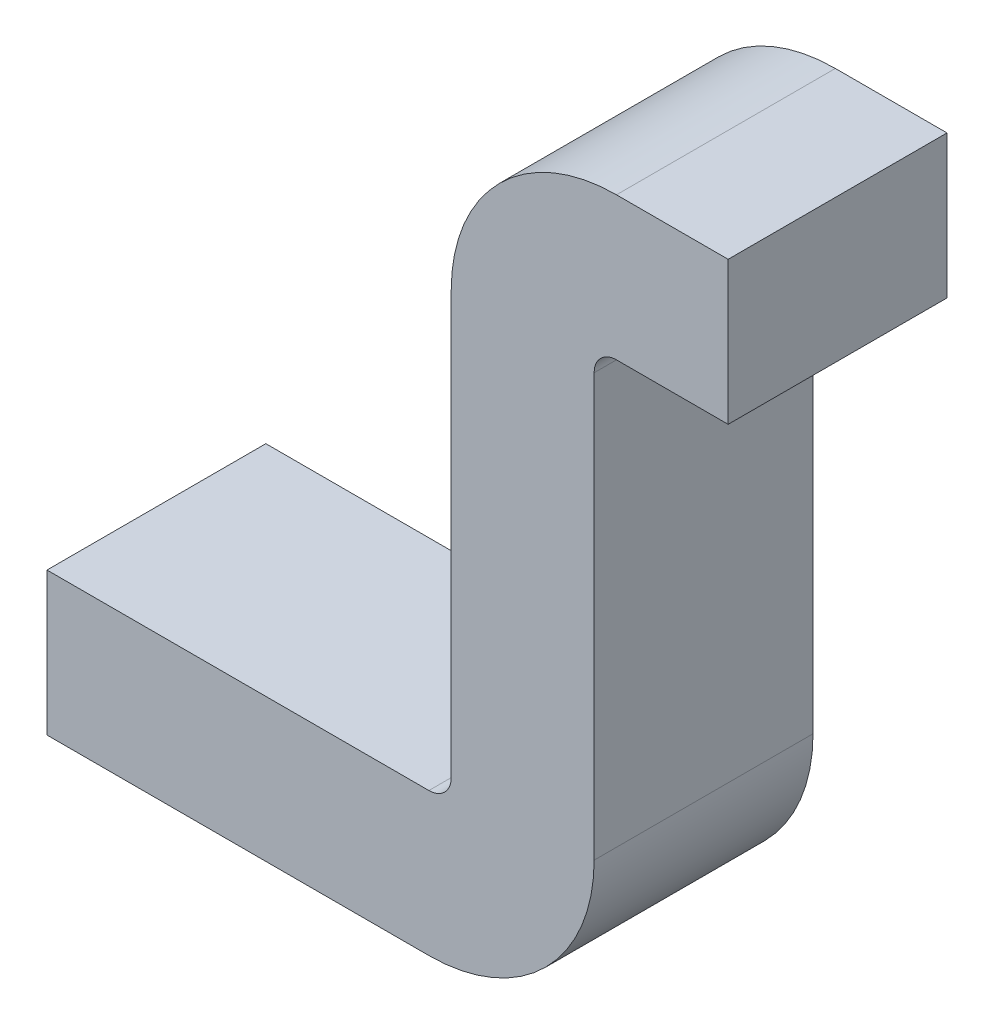
ISO-10303-21;
HEADER;
FILE_DESCRIPTION(('STEP AP214'),'2;1');
FILE_NAME('part.step','',(''),(''),'','','');
FILE_SCHEMA(('AUTOMOTIVE_DESIGN { 1 0 10303 214 1 1 1 1 }'));
ENDSEC;
DATA;
#1=APPLICATION_CONTEXT('core data for automotive mechanical design processes');
#2=APPLICATION_PROTOCOL_DEFINITION('international standard','automotive_design',2000,#1);
#3=PRODUCT_CONTEXT('',#1,'mechanical');
#4=PRODUCT('Part','Part','',(#3));
#5=PRODUCT_RELATED_PRODUCT_CATEGORY('part','',(#4));
#6=PRODUCT_DEFINITION_FORMATION('','',#4);
#7=PRODUCT_DEFINITION_CONTEXT('part definition',#1,'design');
#8=PRODUCT_DEFINITION('design','',#6,#7);
#9=PRODUCT_DEFINITION_SHAPE('','',#8);
#10=(LENGTH_UNIT() NAMED_UNIT(*) SI_UNIT(.MILLI.,.METRE.));
#11=(NAMED_UNIT(*) PLANE_ANGLE_UNIT() SI_UNIT($,.RADIAN.));
#12=(NAMED_UNIT(*) SI_UNIT($,.STERADIAN.) SOLID_ANGLE_UNIT());
#13=UNCERTAINTY_MEASURE_WITH_UNIT(LENGTH_MEASURE(1.E-05),#10,'distance_accuracy_value','');
#14=(GEOMETRIC_REPRESENTATION_CONTEXT(3) GLOBAL_UNCERTAINTY_ASSIGNED_CONTEXT((#13)) GLOBAL_UNIT_ASSIGNED_CONTEXT((#10,
#11,#12)) REPRESENTATION_CONTEXT('',''));
#15=CARTESIAN_POINT('',(0.,0.,0.));
#16=DIRECTION('',(0.,0.,1.));
#17=DIRECTION('',(1.,0.,0.));
#18=AXIS2_PLACEMENT_3D('',#15,#16,#17);
#19=CARTESIAN_POINT('',(-4.47,0.,0.245));
#20=DIRECTION('',(0.,1.,0.));
#21=DIRECTION('',(1.,0.,0.));
#22=AXIS2_PLACEMENT_3D('',#19,#20,#21);
#23=PLANE('',#22);
#24=DIRECTION('',(1.,0.,0.));
#25=VECTOR('',#24,1.);
#26=CARTESIAN_POINT('',(-4.47,0.,-0.245));
#27=LINE('',#26,#25);
#28=CARTESIAN_POINT('',(-5.325,0.,-0.245));
#29=VERTEX_POINT('',#28);
#30=CARTESIAN_POINT('',(-4.47,0.,-0.245));
#31=VERTEX_POINT('',#30);
#32=EDGE_CURVE('E11',#29,#31,#27,.T.);
#33=ORIENTED_EDGE('',*,*,#32,.T.);
#34=DIRECTION('',(0.,0.,-1.));
#35=VECTOR('',#34,1.);
#36=CARTESIAN_POINT('',(-4.47,0.,0.245));
#37=LINE('',#36,#35);
#38=CARTESIAN_POINT('',(-4.47,0.,0.245));
#39=VERTEX_POINT('',#38);
#40=EDGE_CURVE('E42',#39,#31,#37,.T.);
#41=ORIENTED_EDGE('',*,*,#40,.F.);
#42=DIRECTION('',(1.,0.,0.));
#43=VECTOR('',#42,1.);
#44=CARTESIAN_POINT('',(-4.47,0.,0.245));
#45=LINE('',#44,#43);
#46=CARTESIAN_POINT('',(-5.325,0.,0.245));
#47=VERTEX_POINT('',#46);
#48=EDGE_CURVE('E131',#47,#39,#45,.T.);
#49=ORIENTED_EDGE('',*,*,#48,.F.);
#50=DIRECTION('',(0.,0.,-1.));
#51=VECTOR('',#50,1.);
#52=CARTESIAN_POINT('',(-5.325,0.,0.245));
#53=LINE('',#52,#51);
#54=EDGE_CURVE('E27',#47,#29,#53,.T.);
#55=ORIENTED_EDGE('',*,*,#54,.T.);
#56=EDGE_LOOP('',(#33,#41,#49,#55));
#57=FACE_BOUND('',#56,.T.);
#58=ADVANCED_FACE('F16',(#57),#23,.F.);
#59=CARTESIAN_POINT('',(-4.47,0.37,0.245));
#60=DIRECTION('',(0.,0.,-1.));
#61=DIRECTION('',(-1.,0.,0.));
#62=AXIS2_PLACEMENT_3D('',#59,#60,#61);
#63=CYLINDRICAL_SURFACE('',#62,0.37);
#64=CARTESIAN_POINT('',(-4.47,0.37,-0.245));
#65=DIRECTION('',(0.,0.,1.));
#66=DIRECTION('',(-1.,0.,0.));
#67=AXIS2_PLACEMENT_3D('',#64,#65,#66);
#68=CIRCLE('',#67,0.37);
#69=CARTESIAN_POINT('',(-4.1,0.37,-0.245));
#70=VERTEX_POINT('',#69);
#71=EDGE_CURVE('E143',#31,#70,#68,.T.);
#72=ORIENTED_EDGE('',*,*,#71,.T.);
#73=DIRECTION('',(0.,0.,-1.));
#74=VECTOR('',#73,1.);
#75=CARTESIAN_POINT('',(-4.1,0.37,0.245));
#76=LINE('',#75,#74);
#77=CARTESIAN_POINT('',(-4.1,0.37,0.245));
#78=VERTEX_POINT('',#77);
#79=EDGE_CURVE('E199',#78,#70,#76,.T.);
#80=ORIENTED_EDGE('',*,*,#79,.F.);
#81=CARTESIAN_POINT('',(-4.47,0.37,0.245));
#82=DIRECTION('',(0.,0.,1.));
#83=DIRECTION('',(-1.,0.,0.));
#84=AXIS2_PLACEMENT_3D('',#81,#82,#83);
#85=CIRCLE('',#84,0.37);
#86=EDGE_CURVE('E230',#39,#78,#85,.T.);
#87=ORIENTED_EDGE('',*,*,#86,.F.);
#88=ORIENTED_EDGE('',*,*,#40,.T.);
#89=EDGE_LOOP('',(#72,#80,#87,#88));
#90=FACE_BOUND('',#89,.T.);
#91=ADVANCED_FACE('F296',(#90),#63,.T.);
#92=CARTESIAN_POINT('',(-4.1,1.315,0.245));
#93=DIRECTION('',(-1.,0.,0.));
#94=DIRECTION('',(0.,0.,1.));
#95=AXIS2_PLACEMENT_3D('',#92,#93,#94);
#96=PLANE('',#95);
#97=DIRECTION('',(0.,1.,0.));
#98=VECTOR('',#97,1.);
#99=CARTESIAN_POINT('',(-4.1,1.315,-0.245));
#100=LINE('',#99,#98);
#101=CARTESIAN_POINT('',(-4.1,1.315,-0.245));
#102=VERTEX_POINT('',#101);
#103=EDGE_CURVE('E187',#70,#102,#100,.T.);
#104=ORIENTED_EDGE('',*,*,#103,.T.);
#105=DIRECTION('',(0.,0.,-1.));
#106=VECTOR('',#105,1.);
#107=CARTESIAN_POINT('',(-4.1,1.315,0.245));
#108=LINE('',#107,#106);
#109=CARTESIAN_POINT('',(-4.1,1.315,0.245));
#110=VERTEX_POINT('',#109);
#111=EDGE_CURVE('E224',#110,#102,#108,.T.);
#112=ORIENTED_EDGE('',*,*,#111,.F.);
#113=DIRECTION('',(0.,1.,0.));
#114=VECTOR('',#113,1.);
#115=CARTESIAN_POINT('',(-4.1,1.315,0.245));
#116=LINE('',#115,#114);
#117=EDGE_CURVE('E233',#78,#110,#116,.T.);
#118=ORIENTED_EDGE('',*,*,#117,.F.);
#119=ORIENTED_EDGE('',*,*,#79,.T.);
#120=EDGE_LOOP('',(#104,#112,#118,#119));
#121=FACE_BOUND('',#120,.T.);
#122=ADVANCED_FACE('F330',(#121),#96,.F.);
#123=CARTESIAN_POINT('',(-4.05,1.315,0.245));
#124=DIRECTION('',(0.,0.,-1.));
#125=DIRECTION('',(-1.,0.,0.));
#126=AXIS2_PLACEMENT_3D('',#123,#124,#125);
#127=CYLINDRICAL_SURFACE('',#126,0.05);
#128=CARTESIAN_POINT('',(-4.05,1.315,-0.245));
#129=DIRECTION('',(0.,0.,-1.));
#130=DIRECTION('',(1.,0.,0.));
#131=AXIS2_PLACEMENT_3D('',#128,#129,#130);
#132=CIRCLE('',#131,0.05);
#133=CARTESIAN_POINT('',(-4.05,1.365,-0.245));
#134=VERTEX_POINT('',#133);
#135=EDGE_CURVE('E202',#102,#134,#132,.T.);
#136=ORIENTED_EDGE('',*,*,#135,.T.);
#137=DIRECTION('',(0.,0.,-1.));
#138=VECTOR('',#137,1.);
#139=CARTESIAN_POINT('',(-4.05,1.365,0.245));
#140=LINE('',#139,#138);
#141=CARTESIAN_POINT('',(-4.05,1.365,0.245));
#142=VERTEX_POINT('',#141);
#143=EDGE_CURVE('E203',#142,#134,#140,.T.);
#144=ORIENTED_EDGE('',*,*,#143,.F.);
#145=CARTESIAN_POINT('',(-4.05,1.315,0.245));
#146=DIRECTION('',(0.,0.,-1.));
#147=DIRECTION('',(1.,0.,0.));
#148=AXIS2_PLACEMENT_3D('',#145,#146,#147);
#149=CIRCLE('',#148,0.05);
#150=EDGE_CURVE('E174',#110,#142,#149,.T.);
#151=ORIENTED_EDGE('',*,*,#150,.F.);
#152=ORIENTED_EDGE('',*,*,#111,.T.);
#153=EDGE_LOOP('',(#136,#144,#151,#152));
#154=FACE_BOUND('',#153,.T.);
#155=ADVANCED_FACE('F324',(#154),#127,.F.);
#156=CARTESIAN_POINT('',(-3.8,1.365,0.245));
#157=DIRECTION('',(0.,1.,0.));
#158=DIRECTION('',(1.,0.,0.));
#159=AXIS2_PLACEMENT_3D('',#156,#157,#158);
#160=PLANE('',#159);
#161=DIRECTION('',(1.,0.,0.));
#162=VECTOR('',#161,1.);
#163=CARTESIAN_POINT('',(-3.8,1.365,-0.245));
#164=LINE('',#163,#162);
#165=CARTESIAN_POINT('',(-3.8,1.365,-0.245));
#166=VERTEX_POINT('',#165);
#167=EDGE_CURVE('E206',#134,#166,#164,.T.);
#168=ORIENTED_EDGE('',*,*,#167,.T.);
#169=DIRECTION('',(0.,0.,-1.));
#170=VECTOR('',#169,1.);
#171=CARTESIAN_POINT('',(-3.8,1.365,0.245));
#172=LINE('',#171,#170);
#173=CARTESIAN_POINT('',(-3.8,1.365,0.245));
#174=VERTEX_POINT('',#173);
#175=EDGE_CURVE('E180',#174,#166,#172,.T.);
#176=ORIENTED_EDGE('',*,*,#175,.F.);
#177=DIRECTION('',(1.,0.,0.));
#178=VECTOR('',#177,1.);
#179=CARTESIAN_POINT('',(-3.8,1.365,0.245));
#180=LINE('',#179,#178);
#181=EDGE_CURVE('E171',#142,#174,#180,.T.);
#182=ORIENTED_EDGE('',*,*,#181,.F.);
#183=ORIENTED_EDGE('',*,*,#143,.T.);
#184=EDGE_LOOP('',(#168,#176,#182,#183));
#185=FACE_BOUND('',#184,.T.);
#186=ADVANCED_FACE('F329',(#185),#160,.F.);
#187=CARTESIAN_POINT('',(-3.8,1.685,0.245));
#188=DIRECTION('',(-1.,0.,0.));
#189=DIRECTION('',(0.,0.,1.));
#190=AXIS2_PLACEMENT_3D('',#187,#188,#189);
#191=PLANE('',#190);
#192=DIRECTION('',(0.,1.,0.));
#193=VECTOR('',#192,1.);
#194=CARTESIAN_POINT('',(-3.8,1.685,-0.245));
#195=LINE('',#194,#193);
#196=CARTESIAN_POINT('',(-3.8,1.685,-0.245));
#197=VERTEX_POINT('',#196);
#198=EDGE_CURVE('E183',#166,#197,#195,.T.);
#199=ORIENTED_EDGE('',*,*,#198,.T.);
#200=DIRECTION('',(0.,0.,-1.));
#201=VECTOR('',#200,1.);
#202=CARTESIAN_POINT('',(-3.8,1.685,0.245));
#203=LINE('',#202,#201);
#204=CARTESIAN_POINT('',(-3.8,1.685,0.245));
#205=VERTEX_POINT('',#204);
#206=EDGE_CURVE('E191',#205,#197,#203,.T.);
#207=ORIENTED_EDGE('',*,*,#206,.F.);
#208=DIRECTION('',(0.,1.,0.));
#209=VECTOR('',#208,1.);
#210=CARTESIAN_POINT('',(-3.8,1.685,0.245));
#211=LINE('',#210,#209);
#212=EDGE_CURVE('E175',#174,#205,#211,.T.);
#213=ORIENTED_EDGE('',*,*,#212,.F.);
#214=ORIENTED_EDGE('',*,*,#175,.T.);
#215=EDGE_LOOP('',(#199,#207,#213,#214));
#216=FACE_BOUND('',#215,.T.);
#217=ADVANCED_FACE('F367',(#216),#191,.F.);
#218=CARTESIAN_POINT('',(-4.05,1.685,0.245));
#219=DIRECTION('',(0.,-1.,0.));
#220=DIRECTION('',(-1.,0.,0.));
#221=AXIS2_PLACEMENT_3D('',#218,#219,#220);
#222=PLANE('',#221);
#223=DIRECTION('',(-1.,0.,0.));
#224=VECTOR('',#223,1.);
#225=CARTESIAN_POINT('',(-4.05,1.685,-0.245));
#226=LINE('',#225,#224);
#227=CARTESIAN_POINT('',(-4.05,1.685,-0.245));
#228=VERTEX_POINT('',#227);
#229=EDGE_CURVE('E184',#197,#228,#226,.T.);
#230=ORIENTED_EDGE('',*,*,#229,.T.);
#231=DIRECTION('',(0.,0.,-1.));
#232=VECTOR('',#231,1.);
#233=CARTESIAN_POINT('',(-4.05,1.685,0.245));
#234=LINE('',#233,#232);
#235=CARTESIAN_POINT('',(-4.05,1.685,0.245));
#236=VERTEX_POINT('',#235);
#237=EDGE_CURVE('E192',#236,#228,#234,.T.);
#238=ORIENTED_EDGE('',*,*,#237,.F.);
#239=DIRECTION('',(-1.,0.,0.));
#240=VECTOR('',#239,1.);
#241=CARTESIAN_POINT('',(-4.05,1.685,0.245));
#242=LINE('',#241,#240);
#243=EDGE_CURVE('E20',#205,#236,#242,.T.);
#244=ORIENTED_EDGE('',*,*,#243,.F.);
#245=ORIENTED_EDGE('',*,*,#206,.T.);
#246=EDGE_LOOP('',(#230,#238,#244,#245));
#247=FACE_BOUND('',#246,.T.);
#248=ADVANCED_FACE('F359',(#247),#222,.F.);
#249=CARTESIAN_POINT('',(-4.05,1.315,0.245));
#250=DIRECTION('',(0.,0.,-1.));
#251=DIRECTION('',(-1.,0.,0.));
#252=AXIS2_PLACEMENT_3D('',#249,#250,#251);
#253=CYLINDRICAL_SURFACE('',#252,0.37);
#254=CARTESIAN_POINT('',(-4.05,1.315,-0.245));
#255=DIRECTION('',(0.,0.,1.));
#256=DIRECTION('',(-1.,0.,0.));
#257=AXIS2_PLACEMENT_3D('',#254,#255,#256);
#258=CIRCLE('',#257,0.37);
#259=CARTESIAN_POINT('',(-4.42,1.315,-0.245));
#260=VERTEX_POINT('',#259);
#261=EDGE_CURVE('E188',#228,#260,#258,.T.);
#262=ORIENTED_EDGE('',*,*,#261,.T.);
#263=DIRECTION('',(0.,0.,-1.));
#264=VECTOR('',#263,1.);
#265=CARTESIAN_POINT('',(-4.42,1.315,0.245));
#266=LINE('',#265,#264);
#267=CARTESIAN_POINT('',(-4.42,1.315,0.245));
#268=VERTEX_POINT('',#267);
#269=EDGE_CURVE('E168',#268,#260,#266,.T.);
#270=ORIENTED_EDGE('',*,*,#269,.F.);
#271=CARTESIAN_POINT('',(-4.05,1.315,0.245));
#272=DIRECTION('',(0.,0.,1.));
#273=DIRECTION('',(-1.,0.,0.));
#274=AXIS2_PLACEMENT_3D('',#271,#272,#273);
#275=CIRCLE('',#274,0.37);
#276=EDGE_CURVE('E210',#236,#268,#275,.T.);
#277=ORIENTED_EDGE('',*,*,#276,.F.);
#278=ORIENTED_EDGE('',*,*,#237,.T.);
#279=EDGE_LOOP('',(#262,#270,#277,#278));
#280=FACE_BOUND('',#279,.T.);
#281=ADVANCED_FACE('F308',(#280),#253,.T.);
#282=CARTESIAN_POINT('',(-4.42,0.37,0.245));
#283=DIRECTION('',(1.,0.,0.));
#284=DIRECTION('',(0.,0.,1.));
#285=AXIS2_PLACEMENT_3D('',#282,#283,#284);
#286=PLANE('',#285);
#287=DIRECTION('',(0.,-1.,0.));
#288=VECTOR('',#287,1.);
#289=CARTESIAN_POINT('',(-4.42,0.37,-0.245));
#290=LINE('',#289,#288);
#291=CARTESIAN_POINT('',(-4.42,0.37,-0.245));
#292=VERTEX_POINT('',#291);
#293=EDGE_CURVE('E196',#260,#292,#290,.T.);
#294=ORIENTED_EDGE('',*,*,#293,.T.);
#295=DIRECTION('',(0.,0.,-1.));
#296=VECTOR('',#295,1.);
#297=CARTESIAN_POINT('',(-4.42,0.37,0.245));
#298=LINE('',#297,#296);
#299=CARTESIAN_POINT('',(-4.42,0.37,0.245));
#300=VERTEX_POINT('',#299);
#301=EDGE_CURVE('E243',#300,#292,#298,.T.);
#302=ORIENTED_EDGE('',*,*,#301,.F.);
#303=DIRECTION('',(0.,-1.,0.));
#304=VECTOR('',#303,1.);
#305=CARTESIAN_POINT('',(-4.42,0.37,0.245));
#306=LINE('',#305,#304);
#307=EDGE_CURVE('E207',#268,#300,#306,.T.);
#308=ORIENTED_EDGE('',*,*,#307,.F.);
#309=ORIENTED_EDGE('',*,*,#269,.T.);
#310=EDGE_LOOP('',(#294,#302,#308,#309));
#311=FACE_BOUND('',#310,.T.);
#312=ADVANCED_FACE('F303',(#311),#286,.F.);
#313=CARTESIAN_POINT('',(-4.47,0.37,0.245));
#314=DIRECTION('',(0.,0.,-1.));
#315=DIRECTION('',(-1.,0.,0.));
#316=AXIS2_PLACEMENT_3D('',#313,#314,#315);
#317=CYLINDRICAL_SURFACE('',#316,0.0500000000000006);
#318=CARTESIAN_POINT('',(-4.47,0.37,-0.245));
#319=DIRECTION('',(0.,0.,-1.));
#320=DIRECTION('',(1.,0.,0.));
#321=AXIS2_PLACEMENT_3D('',#318,#319,#320);
#322=CIRCLE('',#321,0.0500000000000006);
#323=CARTESIAN_POINT('',(-4.47,0.32,-0.245));
#324=VERTEX_POINT('',#323);
#325=EDGE_CURVE('E246',#292,#324,#322,.T.);
#326=ORIENTED_EDGE('',*,*,#325,.T.);
#327=DIRECTION('',(0.,0.,-1.));
#328=VECTOR('',#327,1.);
#329=CARTESIAN_POINT('',(-4.47,0.32,0.245));
#330=LINE('',#329,#328);
#331=CARTESIAN_POINT('',(-4.47,0.32,0.245));
#332=VERTEX_POINT('',#331);
#333=EDGE_CURVE('E156',#332,#324,#330,.T.);
#334=ORIENTED_EDGE('',*,*,#333,.F.);
#335=CARTESIAN_POINT('',(-4.47,0.37,0.245));
#336=DIRECTION('',(0.,0.,-1.));
#337=DIRECTION('',(1.,0.,0.));
#338=AXIS2_PLACEMENT_3D('',#335,#336,#337);
#339=CIRCLE('',#338,0.0500000000000006);
#340=EDGE_CURVE('E211',#300,#332,#339,.T.);
#341=ORIENTED_EDGE('',*,*,#340,.F.);
#342=ORIENTED_EDGE('',*,*,#301,.T.);
#343=EDGE_LOOP('',(#326,#334,#341,#342));
#344=FACE_BOUND('',#343,.T.);
#345=ADVANCED_FACE('F286',(#344),#317,.F.);
#346=CARTESIAN_POINT('',(-5.325,0.32,0.245));
#347=DIRECTION('',(0.,-1.,0.));
#348=DIRECTION('',(-1.,0.,0.));
#349=AXIS2_PLACEMENT_3D('',#346,#347,#348);
#350=PLANE('',#349);
#351=DIRECTION('',(-1.,0.,0.));
#352=VECTOR('',#351,1.);
#353=CARTESIAN_POINT('',(-5.325,0.32,-0.245));
#354=LINE('',#353,#352);
#355=CARTESIAN_POINT('',(-5.325,0.32,-0.245));
#356=VERTEX_POINT('',#355);
#357=EDGE_CURVE('E164',#324,#356,#354,.T.);
#358=ORIENTED_EDGE('',*,*,#357,.T.);
#359=DIRECTION('',(0.,0.,-1.));
#360=VECTOR('',#359,1.);
#361=CARTESIAN_POINT('',(-5.325,0.32,0.245));
#362=LINE('',#361,#360);
#363=CARTESIAN_POINT('',(-5.325,0.32,0.245));
#364=VERTEX_POINT('',#363);
#365=EDGE_CURVE('E153',#364,#356,#362,.T.);
#366=ORIENTED_EDGE('',*,*,#365,.F.);
#367=DIRECTION('',(-1.,0.,0.));
#368=VECTOR('',#367,1.);
#369=CARTESIAN_POINT('',(-5.325,0.32,0.245));
#370=LINE('',#369,#368);
#371=EDGE_CURVE('E179',#332,#364,#370,.T.);
#372=ORIENTED_EDGE('',*,*,#371,.F.);
#373=ORIENTED_EDGE('',*,*,#333,.T.);
#374=EDGE_LOOP('',(#358,#366,#372,#373));
#375=FACE_BOUND('',#374,.T.);
#376=ADVANCED_FACE('F258',(#375),#350,.F.);
#377=CARTESIAN_POINT('',(-5.325,0.,0.245));
#378=DIRECTION('',(1.,0.,0.));
#379=DIRECTION('',(0.,1.,0.));
#380=AXIS2_PLACEMENT_3D('',#377,#378,#379);
#381=PLANE('',#380);
#382=DIRECTION('',(0.,-1.,0.));
#383=VECTOR('',#382,1.);
#384=CARTESIAN_POINT('',(-5.325,0.,-0.245));
#385=LINE('',#384,#383);
#386=EDGE_CURVE('E149',#356,#29,#385,.T.);
#387=ORIENTED_EDGE('',*,*,#386,.T.);
#388=ORIENTED_EDGE('',*,*,#54,.F.);
#389=DIRECTION('',(0.,-1.,0.));
#390=VECTOR('',#389,1.);
#391=CARTESIAN_POINT('',(-5.325,0.,0.245));
#392=LINE('',#391,#390);
#393=EDGE_CURVE('E176',#364,#47,#392,.T.);
#394=ORIENTED_EDGE('',*,*,#393,.F.);
#395=ORIENTED_EDGE('',*,*,#365,.T.);
#396=EDGE_LOOP('',(#387,#388,#394,#395));
#397=FACE_BOUND('',#396,.T.);
#398=ADVANCED_FACE('F151',(#397),#381,.F.);
#399=CARTESIAN_POINT('',(-4.47,0.37,0.245));
#400=DIRECTION('',(0.,0.,1.));
#401=DIRECTION('',(1.,0.,0.));
#402=AXIS2_PLACEMENT_3D('',#399,#400,#401);
#403=PLANE('',#402);
#404=ORIENTED_EDGE('',*,*,#48,.T.);
#405=ORIENTED_EDGE('',*,*,#86,.T.);
#406=ORIENTED_EDGE('',*,*,#117,.T.);
#407=ORIENTED_EDGE('',*,*,#150,.T.);
#408=ORIENTED_EDGE('',*,*,#181,.T.);
#409=ORIENTED_EDGE('',*,*,#212,.T.);
#410=ORIENTED_EDGE('',*,*,#243,.T.);
#411=ORIENTED_EDGE('',*,*,#276,.T.);
#412=ORIENTED_EDGE('',*,*,#307,.T.);
#413=ORIENTED_EDGE('',*,*,#340,.T.);
#414=ORIENTED_EDGE('',*,*,#371,.T.);
#415=ORIENTED_EDGE('',*,*,#393,.T.);
#416=EDGE_LOOP('',(#404,#405,#406,#407,#408,#409,#410,#411,#412,#413,#414,#415));
#417=FACE_BOUND('',#416,.T.);
#418=ADVANCED_FACE('F18',(#417),#403,.T.);
#419=CARTESIAN_POINT('',(-4.47,0.37,-0.245));
#420=DIRECTION('',(0.,0.,1.));
#421=DIRECTION('',(1.,0.,0.));
#422=AXIS2_PLACEMENT_3D('',#419,#420,#421);
#423=PLANE('',#422);
#424=ORIENTED_EDGE('',*,*,#32,.F.);
#425=ORIENTED_EDGE('',*,*,#386,.F.);
#426=ORIENTED_EDGE('',*,*,#357,.F.);
#427=ORIENTED_EDGE('',*,*,#325,.F.);
#428=ORIENTED_EDGE('',*,*,#293,.F.);
#429=ORIENTED_EDGE('',*,*,#261,.F.);
#430=ORIENTED_EDGE('',*,*,#229,.F.);
#431=ORIENTED_EDGE('',*,*,#198,.F.);
#432=ORIENTED_EDGE('',*,*,#167,.F.);
#433=ORIENTED_EDGE('',*,*,#135,.F.);
#434=ORIENTED_EDGE('',*,*,#103,.F.);
#435=ORIENTED_EDGE('',*,*,#71,.F.);
#436=EDGE_LOOP('',(#424,#425,#426,#427,#428,#429,#430,#431,#432,#433,#434,#435));
#437=FACE_BOUND('',#436,.T.);
#438=ADVANCED_FACE('F147',(#437),#423,.F.);
#439=CLOSED_SHELL('',(#58,#91,#122,#155,#186,#217,#248,#281,#312,#345,#376,#398,#418,#438));
#440=MANIFOLD_SOLID_BREP('B1',#439);
#441=ADVANCED_BREP_SHAPE_REPRESENTATION('',(#18,#440),#14);
#442=SHAPE_DEFINITION_REPRESENTATION(#9,#441);
ENDSEC;
END-ISO-10303-21;
